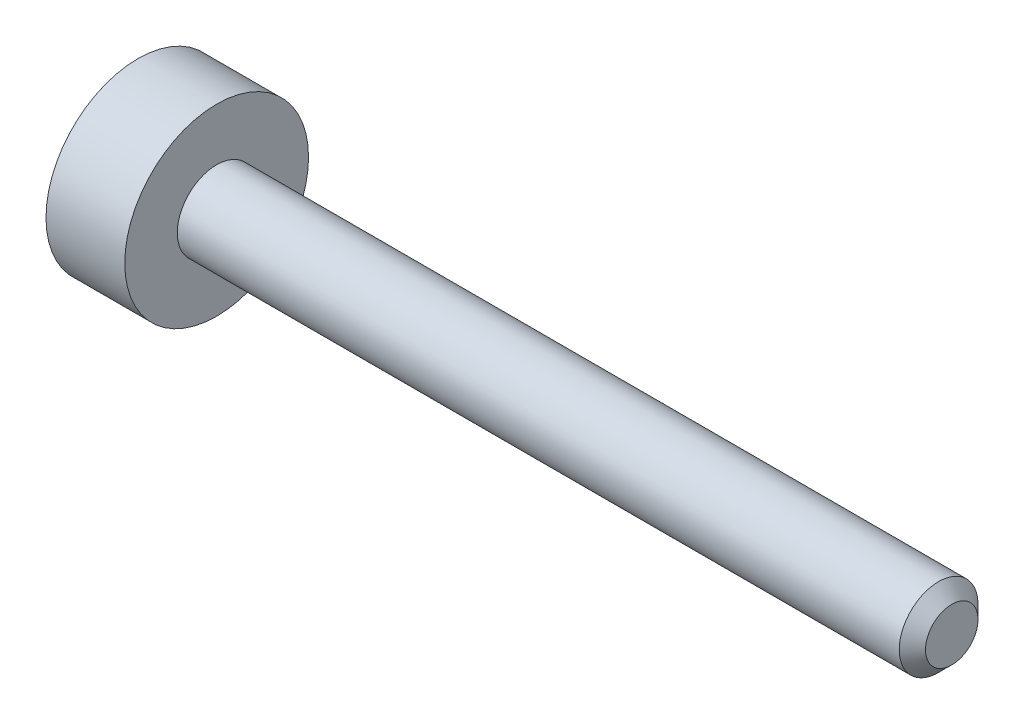
ISO-10303-21;
HEADER;
FILE_DESCRIPTION(('STEP AP214'),'2;1');
FILE_NAME('part.step','',(''),(''),'','','');
FILE_SCHEMA(('AUTOMOTIVE_DESIGN { 1 0 10303 214 1 1 1 1 }'));
ENDSEC;
DATA;
#1=APPLICATION_CONTEXT('core data for automotive mechanical design processes');
#2=APPLICATION_PROTOCOL_DEFINITION('international standard','automotive_design',2000,#1);
#3=PRODUCT_CONTEXT('',#1,'mechanical');
#4=PRODUCT('Part','Part','',(#3));
#5=PRODUCT_RELATED_PRODUCT_CATEGORY('part','',(#4));
#6=PRODUCT_DEFINITION_FORMATION('','',#4);
#7=PRODUCT_DEFINITION_CONTEXT('part definition',#1,'design');
#8=PRODUCT_DEFINITION('design','',#6,#7);
#9=PRODUCT_DEFINITION_SHAPE('','',#8);
#10=(LENGTH_UNIT() NAMED_UNIT(*) SI_UNIT(.MILLI.,.METRE.));
#11=(NAMED_UNIT(*) PLANE_ANGLE_UNIT() SI_UNIT($,.RADIAN.));
#12=(NAMED_UNIT(*) SI_UNIT($,.STERADIAN.) SOLID_ANGLE_UNIT());
#13=UNCERTAINTY_MEASURE_WITH_UNIT(LENGTH_MEASURE(1.E-05),#10,'distance_accuracy_value','');
#14=(GEOMETRIC_REPRESENTATION_CONTEXT(3) GLOBAL_UNCERTAINTY_ASSIGNED_CONTEXT((#13)) GLOBAL_UNIT_ASSIGNED_CONTEXT((#10,
#11,#12)) REPRESENTATION_CONTEXT('',''));
#15=CARTESIAN_POINT('',(0.,0.,0.));
#16=DIRECTION('',(0.,0.,1.));
#17=DIRECTION('',(1.,0.,0.));
#18=AXIS2_PLACEMENT_3D('',#15,#16,#17);
#19=CARTESIAN_POINT('',(0.,0.,0.));
#20=DIRECTION('',(-1.,0.,0.));
#21=DIRECTION('',(0.,0.,1.));
#22=AXIS2_PLACEMENT_3D('',#19,#20,#21);
#23=PLANE('',#22);
#24=CARTESIAN_POINT('',(0.,0.,0.));
#25=DIRECTION('',(-1.,0.,0.));
#26=DIRECTION('',(0.,0.,1.));
#27=AXIS2_PLACEMENT_3D('',#24,#25,#26);
#28=CIRCLE('',#27,1.);
#29=CARTESIAN_POINT('',(0.,0.,1.));
#30=VERTEX_POINT('',#29);
#31=EDGE_CURVE('E11',#30,#30,#28,.T.);
#32=ORIENTED_EDGE('',*,*,#31,.F.);
#33=EDGE_LOOP('',(#32));
#34=FACE_BOUND('',#33,.T.);
#35=ADVANCED_FACE('F41',(#34),#23,.F.);
#36=CARTESIAN_POINT('',(0.,0.,0.));
#37=DIRECTION('',(-1.,0.,0.));
#38=DIRECTION('',(0.,0.,1.));
#39=AXIS2_PLACEMENT_3D('',#36,#37,#38);
#40=CONICAL_SURFACE('',#39,1.,0.785398163397448);
#41=CARTESIAN_POINT('',(-0.5,0.,0.));
#42=DIRECTION('',(-1.,0.,0.));
#43=DIRECTION('',(0.,0.,1.));
#44=AXIS2_PLACEMENT_3D('',#41,#42,#43);
#45=CIRCLE('',#44,1.5);
#46=CARTESIAN_POINT('',(-0.5,0.,1.5));
#47=VERTEX_POINT('',#46);
#48=EDGE_CURVE('E48',#47,#47,#45,.T.);
#49=ORIENTED_EDGE('',*,*,#48,.F.);
#50=EDGE_LOOP('',(#49));
#51=FACE_BOUND('',#50,.T.);
#52=ORIENTED_EDGE('',*,*,#31,.T.);
#53=EDGE_LOOP('',(#52));
#54=FACE_BOUND('',#53,.T.);
#55=ADVANCED_FACE('F160',(#51,#54),#40,.T.);
#56=CARTESIAN_POINT('',(0.,0.,0.));
#57=DIRECTION('',(-1.,0.,0.));
#58=DIRECTION('',(0.,0.,1.));
#59=AXIS2_PLACEMENT_3D('',#56,#57,#58);
#60=CYLINDRICAL_SURFACE('',#59,1.5);
#61=CARTESIAN_POINT('',(-28.,0.,0.));
#62=DIRECTION('',(-1.,0.,0.));
#63=DIRECTION('',(0.,0.,1.));
#64=AXIS2_PLACEMENT_3D('',#61,#62,#63);
#65=CIRCLE('',#64,1.5);
#66=CARTESIAN_POINT('',(-28.,0.,1.5));
#67=VERTEX_POINT('',#66);
#68=EDGE_CURVE('E153',#67,#67,#65,.T.);
#69=ORIENTED_EDGE('',*,*,#68,.F.);
#70=EDGE_LOOP('',(#69));
#71=FACE_BOUND('',#70,.T.);
#72=ORIENTED_EDGE('',*,*,#48,.T.);
#73=EDGE_LOOP('',(#72));
#74=FACE_BOUND('',#73,.T.);
#75=ADVANCED_FACE('F158',(#71,#74),#60,.T.);
#76=CARTESIAN_POINT('',(-28.,1.5,0.));
#77=DIRECTION('',(-1.,0.,0.));
#78=DIRECTION('',(0.,0.,1.));
#79=AXIS2_PLACEMENT_3D('',#76,#77,#78);
#80=PLANE('',#79);
#81=CARTESIAN_POINT('',(-28.,0.,0.));
#82=DIRECTION('',(-1.,0.,0.));
#83=DIRECTION('',(0.,0.,1.));
#84=AXIS2_PLACEMENT_3D('',#81,#82,#83);
#85=CIRCLE('',#84,3.5);
#86=CARTESIAN_POINT('',(-28.,0.,3.5));
#87=VERTEX_POINT('',#86);
#88=EDGE_CURVE('E150',#87,#87,#85,.T.);
#89=ORIENTED_EDGE('',*,*,#88,.F.);
#90=EDGE_LOOP('',(#89));
#91=FACE_BOUND('',#90,.T.);
#92=ORIENTED_EDGE('',*,*,#68,.T.);
#93=EDGE_LOOP('',(#92));
#94=FACE_BOUND('',#93,.T.);
#95=ADVANCED_FACE('F178',(#91,#94),#80,.F.);
#96=CARTESIAN_POINT('',(0.,0.,0.));
#97=DIRECTION('',(-1.,0.,0.));
#98=DIRECTION('',(0.,0.,1.));
#99=AXIS2_PLACEMENT_3D('',#96,#97,#98);
#100=CYLINDRICAL_SURFACE('',#99,3.5);
#101=CARTESIAN_POINT('',(-31.,0.,0.));
#102=DIRECTION('',(-1.,0.,0.));
#103=DIRECTION('',(0.,0.,1.));
#104=AXIS2_PLACEMENT_3D('',#101,#102,#103);
#105=CIRCLE('',#104,3.5);
#106=CARTESIAN_POINT('',(-31.,0.,3.5));
#107=VERTEX_POINT('',#106);
#108=EDGE_CURVE('E142',#107,#107,#105,.T.);
#109=ORIENTED_EDGE('',*,*,#108,.F.);
#110=EDGE_LOOP('',(#109));
#111=FACE_BOUND('',#110,.T.);
#112=ORIENTED_EDGE('',*,*,#88,.T.);
#113=EDGE_LOOP('',(#112));
#114=FACE_BOUND('',#113,.T.);
#115=ADVANCED_FACE('F186',(#111,#114),#100,.T.);
#116=CARTESIAN_POINT('',(-31.,3.5,0.));
#117=DIRECTION('',(1.,0.,0.));
#118=DIRECTION('',(0.,0.,-1.));
#119=AXIS2_PLACEMENT_3D('',#116,#117,#118);
#120=PLANE('',#119);
#121=DIRECTION('',(0.,-0.5,-0.866025403784439));
#122=VECTOR('',#121,1.);
#123=CARTESIAN_POINT('',(-31.,1.73205080756888,0.));
#124=LINE('',#123,#122);
#125=CARTESIAN_POINT('',(-31.,1.73205080756888,0.));
#126=VERTEX_POINT('',#125);
#127=CARTESIAN_POINT('',(-31.,0.86602540378444,-1.5));
#128=VERTEX_POINT('',#127);
#129=EDGE_CURVE('E129',#126,#128,#124,.T.);
#130=ORIENTED_EDGE('',*,*,#129,.F.);
#131=DIRECTION('',(0.,0.5,-0.866025403784439));
#132=VECTOR('',#131,1.);
#133=CARTESIAN_POINT('',(-31.,0.86602540378444,1.5));
#134=LINE('',#133,#132);
#135=CARTESIAN_POINT('',(-31.,0.86602540378444,1.5));
#136=VERTEX_POINT('',#135);
#137=EDGE_CURVE('E55',#136,#126,#134,.T.);
#138=ORIENTED_EDGE('',*,*,#137,.F.);
#139=DIRECTION('',(0.,1.,0.));
#140=VECTOR('',#139,1.);
#141=CARTESIAN_POINT('',(-31.,-0.866025403784439,1.5));
#142=LINE('',#141,#140);
#143=CARTESIAN_POINT('',(-31.,-0.866025403784439,1.5));
#144=VERTEX_POINT('',#143);
#145=EDGE_CURVE('E138',#144,#136,#142,.T.);
#146=ORIENTED_EDGE('',*,*,#145,.F.);
#147=DIRECTION('',(0.,0.5,0.866025403784439));
#148=VECTOR('',#147,1.);
#149=CARTESIAN_POINT('',(-31.,-1.73205080756888,0.));
#150=LINE('',#149,#148);
#151=CARTESIAN_POINT('',(-31.,-1.73205080756888,0.));
#152=VERTEX_POINT('',#151);
#153=EDGE_CURVE('E136',#152,#144,#150,.T.);
#154=ORIENTED_EDGE('',*,*,#153,.F.);
#155=DIRECTION('',(0.,-0.5,0.866025403784438));
#156=VECTOR('',#155,1.);
#157=CARTESIAN_POINT('',(-31.,-0.866025403784438,-1.5));
#158=LINE('',#157,#156);
#159=CARTESIAN_POINT('',(-31.,-0.866025403784438,-1.5));
#160=VERTEX_POINT('',#159);
#161=EDGE_CURVE('E103',#160,#152,#158,.T.);
#162=ORIENTED_EDGE('',*,*,#161,.F.);
#163=DIRECTION('',(0.,-1.,0.));
#164=VECTOR('',#163,1.);
#165=CARTESIAN_POINT('',(-31.,0.86602540378444,-1.5));
#166=LINE('',#165,#164);
#167=EDGE_CURVE('E132',#128,#160,#166,.T.);
#168=ORIENTED_EDGE('',*,*,#167,.F.);
#169=EDGE_LOOP('',(#130,#138,#146,#154,#162,#168));
#170=FACE_BOUND('',#169,.T.);
#171=ORIENTED_EDGE('',*,*,#108,.T.);
#172=EDGE_LOOP('',(#171));
#173=FACE_BOUND('',#172,.T.);
#174=ADVANCED_FACE('F194',(#170,#173),#120,.F.);
#175=CARTESIAN_POINT('',(-29.5,0.86602540378444,1.5));
#176=DIRECTION('',(0.,0.866025403784439,0.5));
#177=DIRECTION('',(0.,-0.5,0.866025403784439));
#178=AXIS2_PLACEMENT_3D('',#175,#176,#177);
#179=PLANE('',#178);
#180=ORIENTED_EDGE('',*,*,#137,.T.);
#181=DIRECTION('',(-1.,0.,0.));
#182=VECTOR('',#181,1.);
#183=CARTESIAN_POINT('',(-29.5,1.73205080756888,0.));
#184=LINE('',#183,#182);
#185=CARTESIAN_POINT('',(-29.5,1.73205080756888,0.));
#186=VERTEX_POINT('',#185);
#187=EDGE_CURVE('E85',#186,#126,#184,.T.);
#188=ORIENTED_EDGE('',*,*,#187,.F.);
#189=DIRECTION('',(0.,0.5,-0.866025403784439));
#190=VECTOR('',#189,1.);
#191=CARTESIAN_POINT('',(-29.5,0.86602540378444,1.5));
#192=LINE('',#191,#190);
#193=CARTESIAN_POINT('',(-29.5,0.86602540378444,1.5));
#194=VERTEX_POINT('',#193);
#195=EDGE_CURVE('E140',#194,#186,#192,.T.);
#196=ORIENTED_EDGE('',*,*,#195,.F.);
#197=DIRECTION('',(-1.,0.,0.));
#198=VECTOR('',#197,1.);
#199=CARTESIAN_POINT('',(-29.5,0.86602540378444,1.5));
#200=LINE('',#199,#198);
#201=EDGE_CURVE('E63',#194,#136,#200,.T.);
#202=ORIENTED_EDGE('',*,*,#201,.T.);
#203=EDGE_LOOP('',(#180,#188,#196,#202));
#204=FACE_BOUND('',#203,.T.);
#205=ADVANCED_FACE('F202',(#204),#179,.F.);
#206=CARTESIAN_POINT('',(-29.5,-0.866025403784439,1.5));
#207=DIRECTION('',(0.,0.,1.));
#208=DIRECTION('',(0.,-1.,0.));
#209=AXIS2_PLACEMENT_3D('',#206,#207,#208);
#210=PLANE('',#209);
#211=ORIENTED_EDGE('',*,*,#145,.T.);
#212=ORIENTED_EDGE('',*,*,#201,.F.);
#213=DIRECTION('',(0.,1.,0.));
#214=VECTOR('',#213,1.);
#215=CARTESIAN_POINT('',(-29.5,-0.866025403784439,1.5));
#216=LINE('',#215,#214);
#217=CARTESIAN_POINT('',(-29.5,-0.866025403784439,1.5));
#218=VERTEX_POINT('',#217);
#219=EDGE_CURVE('E115',#218,#194,#216,.T.);
#220=ORIENTED_EDGE('',*,*,#219,.F.);
#221=DIRECTION('',(-1.,0.,0.));
#222=VECTOR('',#221,1.);
#223=CARTESIAN_POINT('',(-29.5,-0.866025403784439,1.5));
#224=LINE('',#223,#222);
#225=EDGE_CURVE('E107',#218,#144,#224,.T.);
#226=ORIENTED_EDGE('',*,*,#225,.T.);
#227=EDGE_LOOP('',(#211,#212,#220,#226));
#228=FACE_BOUND('',#227,.T.);
#229=ADVANCED_FACE('F210',(#228),#210,.F.);
#230=CARTESIAN_POINT('',(-29.5,-1.73205080756888,0.));
#231=DIRECTION('',(0.,-0.866025403784439,0.5));
#232=DIRECTION('',(0.,-0.5,-0.866025403784439));
#233=AXIS2_PLACEMENT_3D('',#230,#231,#232);
#234=PLANE('',#233);
#235=ORIENTED_EDGE('',*,*,#153,.T.);
#236=ORIENTED_EDGE('',*,*,#225,.F.);
#237=DIRECTION('',(0.,0.5,0.866025403784439));
#238=VECTOR('',#237,1.);
#239=CARTESIAN_POINT('',(-29.5,-1.73205080756888,0.));
#240=LINE('',#239,#238);
#241=CARTESIAN_POINT('',(-29.5,-1.73205080756888,0.));
#242=VERTEX_POINT('',#241);
#243=EDGE_CURVE('E111',#242,#218,#240,.T.);
#244=ORIENTED_EDGE('',*,*,#243,.F.);
#245=DIRECTION('',(-1.,0.,0.));
#246=VECTOR('',#245,1.);
#247=CARTESIAN_POINT('',(-29.5,-1.73205080756888,0.));
#248=LINE('',#247,#246);
#249=EDGE_CURVE('E96',#242,#152,#248,.T.);
#250=ORIENTED_EDGE('',*,*,#249,.T.);
#251=EDGE_LOOP('',(#235,#236,#244,#250));
#252=FACE_BOUND('',#251,.T.);
#253=ADVANCED_FACE('F112',(#252),#234,.F.);
#254=CARTESIAN_POINT('',(-29.5,-0.866025403784438,-1.5));
#255=DIRECTION('',(0.,-0.866025403784439,-0.5));
#256=DIRECTION('',(0.,0.5,-0.866025403784439));
#257=AXIS2_PLACEMENT_3D('',#254,#255,#256);
#258=PLANE('',#257);
#259=ORIENTED_EDGE('',*,*,#161,.T.);
#260=ORIENTED_EDGE('',*,*,#249,.F.);
#261=DIRECTION('',(0.,-0.5,0.866025403784438));
#262=VECTOR('',#261,1.);
#263=CARTESIAN_POINT('',(-29.5,-0.866025403784438,-1.5));
#264=LINE('',#263,#262);
#265=CARTESIAN_POINT('',(-29.5,-0.866025403784438,-1.5));
#266=VERTEX_POINT('',#265);
#267=EDGE_CURVE('E100',#266,#242,#264,.T.);
#268=ORIENTED_EDGE('',*,*,#267,.F.);
#269=DIRECTION('',(-1.,0.,0.));
#270=VECTOR('',#269,1.);
#271=CARTESIAN_POINT('',(-29.5,-0.866025403784438,-1.5));
#272=LINE('',#271,#270);
#273=EDGE_CURVE('E108',#266,#160,#272,.T.);
#274=ORIENTED_EDGE('',*,*,#273,.T.);
#275=EDGE_LOOP('',(#259,#260,#268,#274));
#276=FACE_BOUND('',#275,.T.);
#277=ADVANCED_FACE('F98',(#276),#258,.F.);
#278=CARTESIAN_POINT('',(-29.5,0.86602540378444,-1.5));
#279=DIRECTION('',(0.,0.,-1.));
#280=DIRECTION('',(-1.,0.,0.));
#281=AXIS2_PLACEMENT_3D('',#278,#279,#280);
#282=PLANE('',#281);
#283=ORIENTED_EDGE('',*,*,#167,.T.);
#284=ORIENTED_EDGE('',*,*,#273,.F.);
#285=DIRECTION('',(0.,-1.,0.));
#286=VECTOR('',#285,1.);
#287=CARTESIAN_POINT('',(-29.5,0.86602540378444,-1.5));
#288=LINE('',#287,#286);
#289=CARTESIAN_POINT('',(-29.5,0.86602540378444,-1.5));
#290=VERTEX_POINT('',#289);
#291=EDGE_CURVE('E121',#290,#266,#288,.T.);
#292=ORIENTED_EDGE('',*,*,#291,.F.);
#293=DIRECTION('',(-1.,0.,0.));
#294=VECTOR('',#293,1.);
#295=CARTESIAN_POINT('',(-29.5,0.86602540378444,-1.5));
#296=LINE('',#295,#294);
#297=EDGE_CURVE('E145',#290,#128,#296,.T.);
#298=ORIENTED_EDGE('',*,*,#297,.T.);
#299=EDGE_LOOP('',(#283,#284,#292,#298));
#300=FACE_BOUND('',#299,.T.);
#301=ADVANCED_FACE('F229',(#300),#282,.F.);
#302=CARTESIAN_POINT('',(-29.5,1.73205080756888,0.));
#303=DIRECTION('',(0.,0.866025403784439,-0.5));
#304=DIRECTION('',(0.,0.5,0.866025403784439));
#305=AXIS2_PLACEMENT_3D('',#302,#303,#304);
#306=PLANE('',#305);
#307=ORIENTED_EDGE('',*,*,#129,.T.);
#308=ORIENTED_EDGE('',*,*,#297,.F.);
#309=DIRECTION('',(0.,-0.5,-0.866025403784439));
#310=VECTOR('',#309,1.);
#311=CARTESIAN_POINT('',(-29.5,1.73205080756888,0.));
#312=LINE('',#311,#310);
#313=EDGE_CURVE('E123',#186,#290,#312,.T.);
#314=ORIENTED_EDGE('',*,*,#313,.F.);
#315=ORIENTED_EDGE('',*,*,#187,.T.);
#316=EDGE_LOOP('',(#307,#308,#314,#315));
#317=FACE_BOUND('',#316,.T.);
#318=ADVANCED_FACE('F236',(#317),#306,.F.);
#319=CARTESIAN_POINT('',(-29.5,0.,0.));
#320=DIRECTION('',(-1.,0.,0.));
#321=DIRECTION('',(0.,0.,1.));
#322=AXIS2_PLACEMENT_3D('',#319,#320,#321);
#323=PLANE('',#322);
#324=ORIENTED_EDGE('',*,*,#195,.T.);
#325=ORIENTED_EDGE('',*,*,#313,.T.);
#326=ORIENTED_EDGE('',*,*,#291,.T.);
#327=ORIENTED_EDGE('',*,*,#267,.T.);
#328=ORIENTED_EDGE('',*,*,#243,.T.);
#329=ORIENTED_EDGE('',*,*,#219,.T.);
#330=EDGE_LOOP('',(#324,#325,#326,#327,#328,#329));
#331=FACE_BOUND('',#330,.T.);
#332=ADVANCED_FACE('F118',(#331),#323,.T.);
#333=CLOSED_SHELL('',(#35,#55,#75,#95,#115,#174,#205,#229,#253,#277,#301,#318,#332));
#334=MANIFOLD_SOLID_BREP('B2',#333);
#335=ADVANCED_BREP_SHAPE_REPRESENTATION('',(#18,#334),#14);
#336=SHAPE_DEFINITION_REPRESENTATION(#9,#335);
ENDSEC;
END-ISO-10303-21;
